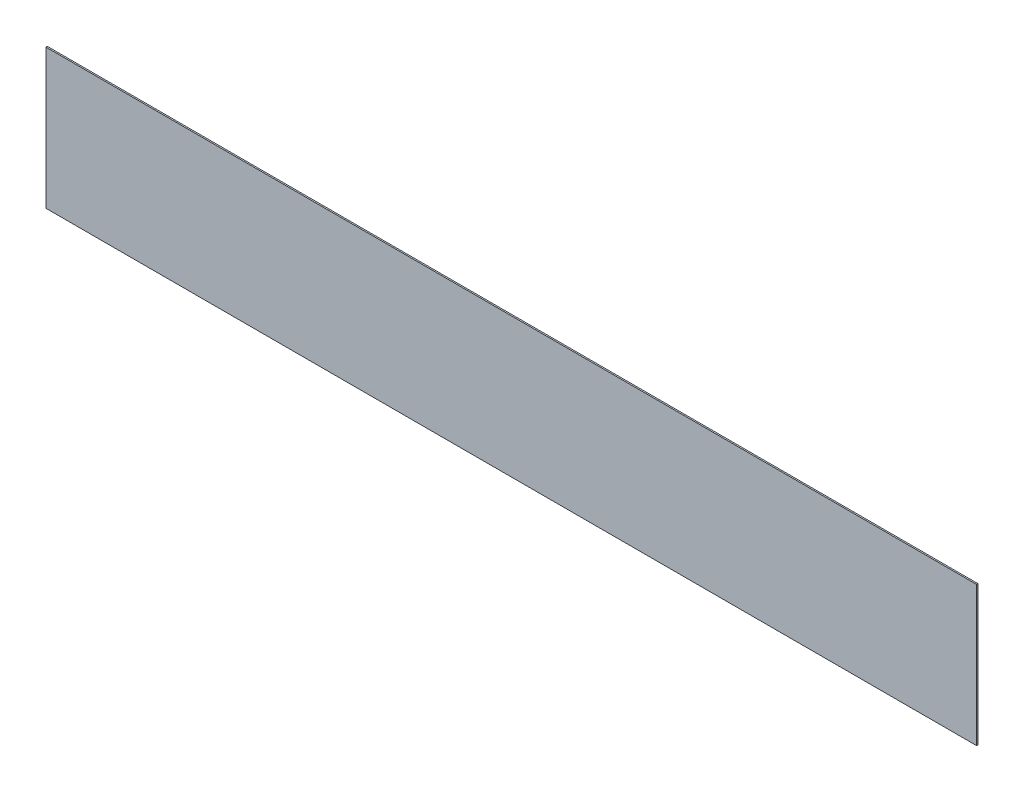
ISO-10303-21;
HEADER;
FILE_DESCRIPTION(('STEP AP214'),'2;1');
FILE_NAME('part.step','',(''),(''),'','','');
FILE_SCHEMA(('AUTOMOTIVE_DESIGN { 1 0 10303 214 1 1 1 1 }'));
ENDSEC;
DATA;
#1=APPLICATION_CONTEXT('core data for automotive mechanical design processes');
#2=APPLICATION_PROTOCOL_DEFINITION('international standard','automotive_design',2000,#1);
#3=PRODUCT_CONTEXT('',#1,'mechanical');
#4=PRODUCT('Part','Part','',(#3));
#5=PRODUCT_RELATED_PRODUCT_CATEGORY('part','',(#4));
#6=PRODUCT_DEFINITION_FORMATION('','',#4);
#7=PRODUCT_DEFINITION_CONTEXT('part definition',#1,'design');
#8=PRODUCT_DEFINITION('design','',#6,#7);
#9=PRODUCT_DEFINITION_SHAPE('','',#8);
#10=(LENGTH_UNIT() NAMED_UNIT(*) SI_UNIT(.MILLI.,.METRE.));
#11=(NAMED_UNIT(*) PLANE_ANGLE_UNIT() SI_UNIT($,.RADIAN.));
#12=(NAMED_UNIT(*) SI_UNIT($,.STERADIAN.) SOLID_ANGLE_UNIT());
#13=UNCERTAINTY_MEASURE_WITH_UNIT(LENGTH_MEASURE(1.E-05),#10,'distance_accuracy_value','');
#14=(GEOMETRIC_REPRESENTATION_CONTEXT(3) GLOBAL_UNCERTAINTY_ASSIGNED_CONTEXT((#13)) GLOBAL_UNIT_ASSIGNED_CONTEXT((#10,
#11,#12)) REPRESENTATION_CONTEXT('',''));
#15=CARTESIAN_POINT('',(0.,0.,0.));
#16=DIRECTION('',(0.,0.,1.));
#17=DIRECTION('',(1.,0.,0.));
#18=AXIS2_PLACEMENT_3D('',#15,#16,#17);
#19=CARTESIAN_POINT('',(100.,15.,0.3));
#20=DIRECTION('',(-1.,0.,0.));
#21=DIRECTION('',(0.,0.,1.));
#22=AXIS2_PLACEMENT_3D('',#19,#20,#21);
#23=PLANE('',#22);
#24=DIRECTION('',(0.,1.,0.));
#25=VECTOR('',#24,1.);
#26=CARTESIAN_POINT('',(100.,15.,0.));
#27=LINE('',#26,#25);
#28=CARTESIAN_POINT('',(100.,-15.,0.));
#29=VERTEX_POINT('',#28);
#30=CARTESIAN_POINT('',(100.,15.,0.));
#31=VERTEX_POINT('',#30);
#32=EDGE_CURVE('E99',#29,#31,#27,.T.);
#33=ORIENTED_EDGE('',*,*,#32,.T.);
#34=DIRECTION('',(0.,0.,-1.));
#35=VECTOR('',#34,1.);
#36=CARTESIAN_POINT('',(100.,15.,0.3));
#37=LINE('',#36,#35);
#38=CARTESIAN_POINT('',(100.,15.,0.3));
#39=VERTEX_POINT('',#38);
#40=EDGE_CURVE('E11',#39,#31,#37,.T.);
#41=ORIENTED_EDGE('',*,*,#40,.F.);
#42=DIRECTION('',(0.,1.,0.));
#43=VECTOR('',#42,1.);
#44=CARTESIAN_POINT('',(100.,15.,0.3));
#45=LINE('',#44,#43);
#46=CARTESIAN_POINT('',(100.,-15.,0.3));
#47=VERTEX_POINT('',#46);
#48=EDGE_CURVE('E87',#47,#39,#45,.T.);
#49=ORIENTED_EDGE('',*,*,#48,.F.);
#50=DIRECTION('',(0.,0.,-1.));
#51=VECTOR('',#50,1.);
#52=CARTESIAN_POINT('',(100.,-15.,0.3));
#53=LINE('',#52,#51);
#54=EDGE_CURVE('E95',#47,#29,#53,.T.);
#55=ORIENTED_EDGE('',*,*,#54,.T.);
#56=EDGE_LOOP('',(#33,#41,#49,#55));
#57=FACE_BOUND('',#56,.T.);
#58=ADVANCED_FACE('F36',(#57),#23,.F.);
#59=CARTESIAN_POINT('',(-100.,15.,0.3));
#60=DIRECTION('',(0.,-1.,0.));
#61=DIRECTION('',(1.,0.,0.));
#62=AXIS2_PLACEMENT_3D('',#59,#60,#61);
#63=PLANE('',#62);
#64=DIRECTION('',(-1.,0.,0.));
#65=VECTOR('',#64,1.);
#66=CARTESIAN_POINT('',(-100.,15.,0.));
#67=LINE('',#66,#65);
#68=CARTESIAN_POINT('',(-100.,15.,0.));
#69=VERTEX_POINT('',#68);
#70=EDGE_CURVE('E91',#31,#69,#67,.T.);
#71=ORIENTED_EDGE('',*,*,#70,.T.);
#72=DIRECTION('',(0.,0.,-1.));
#73=VECTOR('',#72,1.);
#74=CARTESIAN_POINT('',(-100.,15.,0.3));
#75=LINE('',#74,#73);
#76=CARTESIAN_POINT('',(-100.,15.,0.3));
#77=VERTEX_POINT('',#76);
#78=EDGE_CURVE('E44',#77,#69,#75,.T.);
#79=ORIENTED_EDGE('',*,*,#78,.F.);
#80=DIRECTION('',(-1.,0.,0.));
#81=VECTOR('',#80,1.);
#82=CARTESIAN_POINT('',(-100.,15.,0.3));
#83=LINE('',#82,#81);
#84=EDGE_CURVE('E82',#39,#77,#83,.T.);
#85=ORIENTED_EDGE('',*,*,#84,.F.);
#86=ORIENTED_EDGE('',*,*,#40,.T.);
#87=EDGE_LOOP('',(#71,#79,#85,#86));
#88=FACE_BOUND('',#87,.T.);
#89=ADVANCED_FACE('F90',(#88),#63,.F.);
#90=CARTESIAN_POINT('',(-100.,15.,0.3));
#91=DIRECTION('',(1.,0.,0.));
#92=DIRECTION('',(0.,0.,-1.));
#93=AXIS2_PLACEMENT_3D('',#90,#91,#92);
#94=PLANE('',#93);
#95=DIRECTION('',(0.,-1.,0.));
#96=VECTOR('',#95,1.);
#97=CARTESIAN_POINT('',(-100.,15.,0.));
#98=LINE('',#97,#96);
#99=CARTESIAN_POINT('',(-100.,-15.,0.));
#100=VERTEX_POINT('',#99);
#101=EDGE_CURVE('E69',#69,#100,#98,.T.);
#102=ORIENTED_EDGE('',*,*,#101,.T.);
#103=DIRECTION('',(0.,0.,-1.));
#104=VECTOR('',#103,1.);
#105=CARTESIAN_POINT('',(-100.,-15.,0.3));
#106=LINE('',#105,#104);
#107=CARTESIAN_POINT('',(-100.,-15.,0.3));
#108=VERTEX_POINT('',#107);
#109=EDGE_CURVE('E92',#108,#100,#106,.T.);
#110=ORIENTED_EDGE('',*,*,#109,.F.);
#111=DIRECTION('',(0.,-1.,0.));
#112=VECTOR('',#111,1.);
#113=CARTESIAN_POINT('',(-100.,15.,0.3));
#114=LINE('',#113,#112);
#115=EDGE_CURVE('E85',#77,#108,#114,.T.);
#116=ORIENTED_EDGE('',*,*,#115,.F.);
#117=ORIENTED_EDGE('',*,*,#78,.T.);
#118=EDGE_LOOP('',(#102,#110,#116,#117));
#119=FACE_BOUND('',#118,.T.);
#120=ADVANCED_FACE('F93',(#119),#94,.F.);
#121=CARTESIAN_POINT('',(-100.,-15.,0.3));
#122=DIRECTION('',(0.,1.,0.));
#123=DIRECTION('',(0.,0.,1.));
#124=AXIS2_PLACEMENT_3D('',#121,#122,#123);
#125=PLANE('',#124);
#126=DIRECTION('',(1.,0.,0.));
#127=VECTOR('',#126,1.);
#128=CARTESIAN_POINT('',(-100.,-15.,0.));
#129=LINE('',#128,#127);
#130=EDGE_CURVE('E75',#100,#29,#129,.T.);
#131=ORIENTED_EDGE('',*,*,#130,.T.);
#132=ORIENTED_EDGE('',*,*,#54,.F.);
#133=DIRECTION('',(1.,0.,0.));
#134=VECTOR('',#133,1.);
#135=CARTESIAN_POINT('',(-100.,-15.,0.3));
#136=LINE('',#135,#134);
#137=EDGE_CURVE('E52',#108,#47,#136,.T.);
#138=ORIENTED_EDGE('',*,*,#137,.F.);
#139=ORIENTED_EDGE('',*,*,#109,.T.);
#140=EDGE_LOOP('',(#131,#132,#138,#139));
#141=FACE_BOUND('',#140,.T.);
#142=ADVANCED_FACE('F106',(#141),#125,.F.);
#143=CARTESIAN_POINT('',(0.,0.,0.3));
#144=DIRECTION('',(0.,0.,1.));
#145=DIRECTION('',(1.,0.,0.));
#146=AXIS2_PLACEMENT_3D('',#143,#144,#145);
#147=PLANE('',#146);
#148=ORIENTED_EDGE('',*,*,#48,.T.);
#149=ORIENTED_EDGE('',*,*,#84,.T.);
#150=ORIENTED_EDGE('',*,*,#115,.T.);
#151=ORIENTED_EDGE('',*,*,#137,.T.);
#152=EDGE_LOOP('',(#148,#149,#150,#151));
#153=FACE_BOUND('',#152,.T.);
#154=ADVANCED_FACE('F83',(#153),#147,.T.);
#155=CARTESIAN_POINT('',(0.,0.,0.));
#156=DIRECTION('',(0.,0.,1.));
#157=DIRECTION('',(1.,0.,0.));
#158=AXIS2_PLACEMENT_3D('',#155,#156,#157);
#159=PLANE('',#158);
#160=ORIENTED_EDGE('',*,*,#32,.F.);
#161=ORIENTED_EDGE('',*,*,#130,.F.);
#162=ORIENTED_EDGE('',*,*,#101,.F.);
#163=ORIENTED_EDGE('',*,*,#70,.F.);
#164=EDGE_LOOP('',(#160,#161,#162,#163));
#165=FACE_BOUND('',#164,.T.);
#166=ADVANCED_FACE('F109',(#165),#159,.F.);
#167=CLOSED_SHELL('',(#58,#89,#120,#142,#154,#166));
#168=MANIFOLD_SOLID_BREP('B2',#167);
#169=ADVANCED_BREP_SHAPE_REPRESENTATION('',(#18,#168),#14);
#170=SHAPE_DEFINITION_REPRESENTATION(#9,#169);
ENDSEC;
END-ISO-10303-21;
